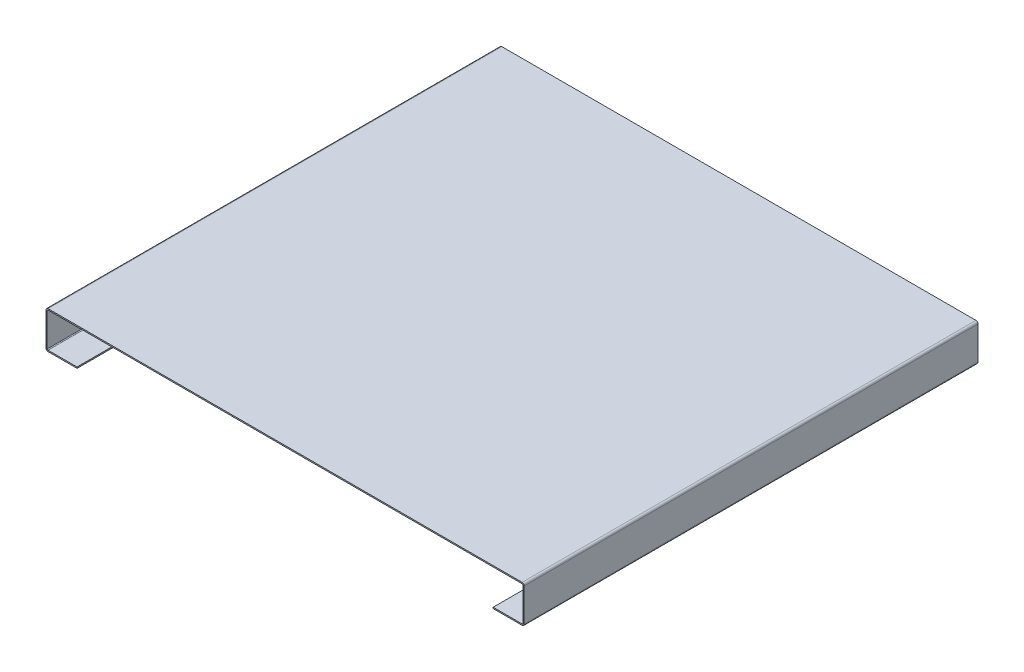
ISO-10303-21;
HEADER;
FILE_DESCRIPTION(('STEP AP214'),'2;1');
FILE_NAME('part.step','',(''),(''),'','','');
FILE_SCHEMA(('AUTOMOTIVE_DESIGN { 1 0 10303 214 1 1 1 1 }'));
ENDSEC;
DATA;
#1=APPLICATION_CONTEXT('core data for automotive mechanical design processes');
#2=APPLICATION_PROTOCOL_DEFINITION('international standard','automotive_design',2000,#1);
#3=PRODUCT_CONTEXT('',#1,'mechanical');
#4=PRODUCT('Part','Part','',(#3));
#5=PRODUCT_RELATED_PRODUCT_CATEGORY('part','',(#4));
#6=PRODUCT_DEFINITION_FORMATION('','',#4);
#7=PRODUCT_DEFINITION_CONTEXT('part definition',#1,'design');
#8=PRODUCT_DEFINITION('design','',#6,#7);
#9=PRODUCT_DEFINITION_SHAPE('','',#8);
#10=(LENGTH_UNIT() NAMED_UNIT(*) SI_UNIT(.MILLI.,.METRE.));
#11=(NAMED_UNIT(*) PLANE_ANGLE_UNIT() SI_UNIT($,.RADIAN.));
#12=(NAMED_UNIT(*) SI_UNIT($,.STERADIAN.) SOLID_ANGLE_UNIT());
#13=UNCERTAINTY_MEASURE_WITH_UNIT(LENGTH_MEASURE(1.E-05),#10,'distance_accuracy_value','');
#14=(GEOMETRIC_REPRESENTATION_CONTEXT(3) GLOBAL_UNCERTAINTY_ASSIGNED_CONTEXT((#13)) GLOBAL_UNIT_ASSIGNED_CONTEXT((#10,
#11,#12)) REPRESENTATION_CONTEXT('',''));
#15=CARTESIAN_POINT('',(0.,0.,0.));
#16=DIRECTION('',(0.,0.,1.));
#17=DIRECTION('',(1.,0.,0.));
#18=AXIS2_PLACEMENT_3D('',#15,#16,#17);
#19=CARTESIAN_POINT('',(0.,5.,1096.));
#20=DIRECTION('',(0.,0.,1.));
#21=DIRECTION('',(1.,0.,0.));
#22=AXIS2_PLACEMENT_3D('',#19,#20,#21);
#23=PLANE('',#22);
#24=DIRECTION('',(1.,0.,0.));
#25=VECTOR('',#24,1.);
#26=CARTESIAN_POINT('',(0.,5.,1096.));
#27=LINE('',#26,#25);
#28=CARTESIAN_POINT('',(0.,5.,1096.));
#29=VERTEX_POINT('',#28);
#30=CARTESIAN_POINT('',(3.,5.,1096.));
#31=VERTEX_POINT('',#30);
#32=EDGE_CURVE('E11',#29,#31,#27,.T.);
#33=ORIENTED_EDGE('',*,*,#32,.F.);
#34=CARTESIAN_POINT('',(5.,5.,1096.));
#35=DIRECTION('',(0.,0.,1.));
#36=DIRECTION('',(1.,0.,0.));
#37=AXIS2_PLACEMENT_3D('',#34,#35,#36);
#38=CIRCLE('',#37,5.);
#39=CARTESIAN_POINT('',(5.,0.,1096.));
#40=VERTEX_POINT('',#39);
#41=EDGE_CURVE('E367',#40,#29,#38,.F.);
#42=ORIENTED_EDGE('',*,*,#41,.F.);
#43=DIRECTION('',(0.,-1.,0.));
#44=VECTOR('',#43,1.);
#45=CARTESIAN_POINT('',(5.,3.,1096.));
#46=LINE('',#45,#44);
#47=CARTESIAN_POINT('',(5.,3.,1096.));
#48=VERTEX_POINT('',#47);
#49=EDGE_CURVE('E46',#48,#40,#46,.T.);
#50=ORIENTED_EDGE('',*,*,#49,.F.);
#51=CARTESIAN_POINT('',(5.,5.,1096.));
#52=DIRECTION('',(0.,0.,1.));
#53=DIRECTION('',(1.,0.,0.));
#54=AXIS2_PLACEMENT_3D('',#51,#52,#53);
#55=CIRCLE('',#54,2.);
#56=EDGE_CURVE('E380',#48,#31,#55,.F.);
#57=ORIENTED_EDGE('',*,*,#56,.T.);
#58=EDGE_LOOP('',(#33,#42,#50,#57));
#59=FACE_BOUND('',#58,.T.);
#60=ADVANCED_FACE('F38',(#59),#23,.T.);
#61=CARTESIAN_POINT('',(5.,3.,1096.));
#62=DIRECTION('',(0.,0.,1.));
#63=DIRECTION('',(1.,0.,0.));
#64=AXIS2_PLACEMENT_3D('',#61,#62,#63);
#65=PLANE('',#64);
#66=DIRECTION('',(0.,1.,0.));
#67=VECTOR('',#66,1.);
#68=CARTESIAN_POINT('',(0.,0.,1096.));
#69=LINE('',#68,#67);
#70=CARTESIAN_POINT('',(0.,84.9999999999999,1096.));
#71=VERTEX_POINT('',#70);
#72=EDGE_CURVE('E371',#29,#71,#69,.T.);
#73=ORIENTED_EDGE('',*,*,#72,.F.);
#74=ORIENTED_EDGE('',*,*,#32,.T.);
#75=DIRECTION('',(0.,1.,0.));
#76=VECTOR('',#75,1.);
#77=CARTESIAN_POINT('',(3.,0.,1096.));
#78=LINE('',#77,#76);
#79=CARTESIAN_POINT('',(3.,85.,1096.));
#80=VERTEX_POINT('',#79);
#81=EDGE_CURVE('E382',#31,#80,#78,.T.);
#82=ORIENTED_EDGE('',*,*,#81,.T.);
#83=DIRECTION('',(-1.,0.,0.));
#84=VECTOR('',#83,1.);
#85=CARTESIAN_POINT('',(3.,85.,1096.));
#86=LINE('',#85,#84);
#87=EDGE_CURVE('E341',#80,#71,#86,.T.);
#88=ORIENTED_EDGE('',*,*,#87,.T.);
#89=EDGE_LOOP('',(#73,#74,#82,#88));
#90=FACE_BOUND('',#89,.T.);
#91=ADVANCED_FACE('F451',(#90),#65,.T.);
#92=CARTESIAN_POINT('',(5.,0.,0.));
#93=DIRECTION('',(0.,0.,-1.));
#94=DIRECTION('',(-1.,0.,0.));
#95=AXIS2_PLACEMENT_3D('',#92,#93,#94);
#96=PLANE('',#95);
#97=DIRECTION('',(0.,1.,0.));
#98=VECTOR('',#97,1.);
#99=CARTESIAN_POINT('',(5.,0.,0.));
#100=LINE('',#99,#98);
#101=CARTESIAN_POINT('',(5.,0.,0.));
#102=VERTEX_POINT('',#101);
#103=CARTESIAN_POINT('',(5.,3.,0.));
#104=VERTEX_POINT('',#103);
#105=EDGE_CURVE('E347',#102,#104,#100,.T.);
#106=ORIENTED_EDGE('',*,*,#105,.F.);
#107=CARTESIAN_POINT('',(5.,5.,0.));
#108=DIRECTION('',(0.,0.,1.));
#109=DIRECTION('',(1.,0.,0.));
#110=AXIS2_PLACEMENT_3D('',#107,#108,#109);
#111=CIRCLE('',#110,5.);
#112=CARTESIAN_POINT('',(0.,5.,0.));
#113=VERTEX_POINT('',#112);
#114=EDGE_CURVE('E251',#102,#113,#111,.F.);
#115=ORIENTED_EDGE('',*,*,#114,.T.);
#116=DIRECTION('',(-1.,0.,0.));
#117=VECTOR('',#116,1.);
#118=CARTESIAN_POINT('',(3.,5.,0.));
#119=LINE('',#118,#117);
#120=CARTESIAN_POINT('',(3.,5.,0.));
#121=VERTEX_POINT('',#120);
#122=EDGE_CURVE('E345',#121,#113,#119,.T.);
#123=ORIENTED_EDGE('',*,*,#122,.F.);
#124=CARTESIAN_POINT('',(5.,5.,0.));
#125=DIRECTION('',(0.,0.,1.));
#126=DIRECTION('',(1.,0.,0.));
#127=AXIS2_PLACEMENT_3D('',#124,#125,#126);
#128=CIRCLE('',#127,2.);
#129=EDGE_CURVE('E263',#104,#121,#128,.F.);
#130=ORIENTED_EDGE('',*,*,#129,.F.);
#131=EDGE_LOOP('',(#106,#115,#123,#130));
#132=FACE_BOUND('',#131,.T.);
#133=ADVANCED_FACE('F493',(#132),#96,.T.);
#134=CARTESIAN_POINT('',(3.,5.,0.));
#135=DIRECTION('',(0.,0.,-1.));
#136=DIRECTION('',(-1.,0.,0.));
#137=AXIS2_PLACEMENT_3D('',#134,#135,#136);
#138=PLANE('',#137);
#139=DIRECTION('',(-1.,0.,0.));
#140=VECTOR('',#139,1.);
#141=CARTESIAN_POINT('',(75.,0.,0.));
#142=LINE('',#141,#140);
#143=CARTESIAN_POINT('',(75.,0.,0.));
#144=VERTEX_POINT('',#143);
#145=EDGE_CURVE('E254',#144,#102,#142,.T.);
#146=ORIENTED_EDGE('',*,*,#145,.T.);
#147=ORIENTED_EDGE('',*,*,#105,.T.);
#148=DIRECTION('',(-1.,0.,0.));
#149=VECTOR('',#148,1.);
#150=CARTESIAN_POINT('',(75.,3.,0.));
#151=LINE('',#150,#149);
#152=CARTESIAN_POINT('',(75.,3.,0.));
#153=VERTEX_POINT('',#152);
#154=EDGE_CURVE('E260',#153,#104,#151,.T.);
#155=ORIENTED_EDGE('',*,*,#154,.F.);
#156=DIRECTION('',(0.,-1.,0.));
#157=VECTOR('',#156,1.);
#158=CARTESIAN_POINT('',(75.,3.,0.));
#159=LINE('',#158,#157);
#160=EDGE_CURVE('E257',#153,#144,#159,.T.);
#161=ORIENTED_EDGE('',*,*,#160,.T.);
#162=EDGE_LOOP('',(#146,#147,#155,#161));
#163=FACE_BOUND('',#162,.T.);
#164=ADVANCED_FACE('F497',(#163),#138,.T.);
#165=CARTESIAN_POINT('',(5.,90.,1096.));
#166=DIRECTION('',(0.,0.,1.));
#167=DIRECTION('',(1.,0.,0.));
#168=AXIS2_PLACEMENT_3D('',#165,#166,#167);
#169=PLANE('',#168);
#170=DIRECTION('',(0.,-1.,0.));
#171=VECTOR('',#170,1.);
#172=CARTESIAN_POINT('',(5.,90.,1096.));
#173=LINE('',#172,#171);
#174=CARTESIAN_POINT('',(5.,90.,1096.));
#175=VERTEX_POINT('',#174);
#176=CARTESIAN_POINT('',(5.,87.,1096.));
#177=VERTEX_POINT('',#176);
#178=EDGE_CURVE('E343',#175,#177,#173,.T.);
#179=ORIENTED_EDGE('',*,*,#178,.F.);
#180=CARTESIAN_POINT('',(5.,85.,1096.));
#181=DIRECTION('',(0.,0.,1.));
#182=DIRECTION('',(1.,0.,0.));
#183=AXIS2_PLACEMENT_3D('',#180,#181,#182);
#184=CIRCLE('',#183,5.);
#185=EDGE_CURVE('E441',#71,#175,#184,.F.);
#186=ORIENTED_EDGE('',*,*,#185,.F.);
#187=ORIENTED_EDGE('',*,*,#87,.F.);
#188=CARTESIAN_POINT('',(5.,85.,1096.));
#189=DIRECTION('',(0.,0.,1.));
#190=DIRECTION('',(1.,0.,0.));
#191=AXIS2_PLACEMENT_3D('',#188,#189,#190);
#192=CIRCLE('',#191,2.);
#193=EDGE_CURVE('E385',#80,#177,#192,.F.);
#194=ORIENTED_EDGE('',*,*,#193,.T.);
#195=EDGE_LOOP('',(#179,#186,#187,#194));
#196=FACE_BOUND('',#195,.T.);
#197=ADVANCED_FACE('F458',(#196),#169,.T.);
#198=CARTESIAN_POINT('',(3.,85.,1096.));
#199=DIRECTION('',(0.,0.,1.));
#200=DIRECTION('',(1.,0.,0.));
#201=AXIS2_PLACEMENT_3D('',#198,#199,#200);
#202=PLANE('',#201);
#203=DIRECTION('',(1.,0.,0.));
#204=VECTOR('',#203,1.);
#205=CARTESIAN_POINT('',(0.,90.,1096.));
#206=LINE('',#205,#204);
#207=CARTESIAN_POINT('',(1150.,90.,1096.));
#208=VERTEX_POINT('',#207);
#209=EDGE_CURVE('E438',#175,#208,#206,.T.);
#210=ORIENTED_EDGE('',*,*,#209,.F.);
#211=ORIENTED_EDGE('',*,*,#178,.T.);
#212=DIRECTION('',(1.,0.,0.));
#213=VECTOR('',#212,1.);
#214=CARTESIAN_POINT('',(0.,87.,1096.));
#215=LINE('',#214,#213);
#216=CARTESIAN_POINT('',(1150.,87.,1096.));
#217=VERTEX_POINT('',#216);
#218=EDGE_CURVE('E205',#177,#217,#215,.T.);
#219=ORIENTED_EDGE('',*,*,#218,.T.);
#220=DIRECTION('',(0.,1.,0.));
#221=VECTOR('',#220,1.);
#222=CARTESIAN_POINT('',(1150.,87.,1096.));
#223=LINE('',#222,#221);
#224=EDGE_CURVE('E196',#217,#208,#223,.T.);
#225=ORIENTED_EDGE('',*,*,#224,.T.);
#226=EDGE_LOOP('',(#210,#211,#219,#225));
#227=FACE_BOUND('',#226,.T.);
#228=ADVANCED_FACE('F391',(#227),#202,.T.);
#229=CARTESIAN_POINT('',(0.,84.9999999999999,0.));
#230=DIRECTION('',(0.,0.,-1.));
#231=DIRECTION('',(-1.,0.,0.));
#232=AXIS2_PLACEMENT_3D('',#229,#230,#231);
#233=PLANE('',#232);
#234=DIRECTION('',(1.,0.,0.));
#235=VECTOR('',#234,1.);
#236=CARTESIAN_POINT('',(0.,84.9999999999999,0.));
#237=LINE('',#236,#235);
#238=CARTESIAN_POINT('',(0.,84.9999999999999,0.));
#239=VERTEX_POINT('',#238);
#240=CARTESIAN_POINT('',(3.,85.,0.));
#241=VERTEX_POINT('',#240);
#242=EDGE_CURVE('E339',#239,#241,#237,.T.);
#243=ORIENTED_EDGE('',*,*,#242,.F.);
#244=CARTESIAN_POINT('',(5.,85.,0.));
#245=DIRECTION('',(0.,0.,1.));
#246=DIRECTION('',(1.,0.,0.));
#247=AXIS2_PLACEMENT_3D('',#244,#245,#246);
#248=CIRCLE('',#247,5.);
#249=CARTESIAN_POINT('',(5.,90.,0.));
#250=VERTEX_POINT('',#249);
#251=EDGE_CURVE('E245',#239,#250,#248,.F.);
#252=ORIENTED_EDGE('',*,*,#251,.T.);
#253=DIRECTION('',(0.,1.,0.));
#254=VECTOR('',#253,1.);
#255=CARTESIAN_POINT('',(5.,87.,0.));
#256=LINE('',#255,#254);
#257=CARTESIAN_POINT('',(5.,87.,0.));
#258=VERTEX_POINT('',#257);
#259=EDGE_CURVE('E195',#258,#250,#256,.T.);
#260=ORIENTED_EDGE('',*,*,#259,.F.);
#261=CARTESIAN_POINT('',(5.,85.,0.));
#262=DIRECTION('',(0.,0.,1.));
#263=DIRECTION('',(1.,0.,0.));
#264=AXIS2_PLACEMENT_3D('',#261,#262,#263);
#265=CIRCLE('',#264,2.);
#266=EDGE_CURVE('E269',#241,#258,#265,.F.);
#267=ORIENTED_EDGE('',*,*,#266,.F.);
#268=EDGE_LOOP('',(#243,#252,#260,#267));
#269=FACE_BOUND('',#268,.T.);
#270=ADVANCED_FACE('F467',(#269),#233,.T.);
#271=CARTESIAN_POINT('',(5.,87.,0.));
#272=DIRECTION('',(0.,0.,-1.));
#273=DIRECTION('',(-1.,0.,0.));
#274=AXIS2_PLACEMENT_3D('',#271,#272,#273);
#275=PLANE('',#274);
#276=DIRECTION('',(0.,1.,0.));
#277=VECTOR('',#276,1.);
#278=CARTESIAN_POINT('',(0.,0.,0.));
#279=LINE('',#278,#277);
#280=EDGE_CURVE('E248',#113,#239,#279,.T.);
#281=ORIENTED_EDGE('',*,*,#280,.T.);
#282=ORIENTED_EDGE('',*,*,#242,.T.);
#283=DIRECTION('',(0.,1.,0.));
#284=VECTOR('',#283,1.);
#285=CARTESIAN_POINT('',(3.,0.,0.));
#286=LINE('',#285,#284);
#287=EDGE_CURVE('E266',#121,#241,#286,.T.);
#288=ORIENTED_EDGE('',*,*,#287,.F.);
#289=ORIENTED_EDGE('',*,*,#122,.T.);
#290=EDGE_LOOP('',(#281,#282,#288,#289));
#291=FACE_BOUND('',#290,.T.);
#292=ADVANCED_FACE('F471',(#291),#275,.T.);
#293=CARTESIAN_POINT('',(1155.,85.,1096.));
#294=DIRECTION('',(0.,0.,1.));
#295=DIRECTION('',(1.,0.,0.));
#296=AXIS2_PLACEMENT_3D('',#293,#294,#295);
#297=PLANE('',#296);
#298=DIRECTION('',(-1.,0.,0.));
#299=VECTOR('',#298,1.);
#300=CARTESIAN_POINT('',(1155.,85.,1096.));
#301=LINE('',#300,#299);
#302=CARTESIAN_POINT('',(1155.,85.,1096.));
#303=VERTEX_POINT('',#302);
#304=CARTESIAN_POINT('',(1152.,85.,1096.));
#305=VERTEX_POINT('',#304);
#306=EDGE_CURVE('E183',#303,#305,#301,.T.);
#307=ORIENTED_EDGE('',*,*,#306,.F.);
#308=CARTESIAN_POINT('',(1150.,85.,1096.));
#309=DIRECTION('',(0.,0.,1.));
#310=DIRECTION('',(1.,0.,0.));
#311=AXIS2_PLACEMENT_3D('',#308,#309,#310);
#312=CIRCLE('',#311,5.);
#313=EDGE_CURVE('E403',#208,#303,#312,.F.);
#314=ORIENTED_EDGE('',*,*,#313,.F.);
#315=ORIENTED_EDGE('',*,*,#224,.F.);
#316=CARTESIAN_POINT('',(1150.,85.,1096.));
#317=DIRECTION('',(0.,0.,1.));
#318=DIRECTION('',(1.,0.,0.));
#319=AXIS2_PLACEMENT_3D('',#316,#317,#318);
#320=CIRCLE('',#319,2.);
#321=EDGE_CURVE('E199',#217,#305,#320,.F.);
#322=ORIENTED_EDGE('',*,*,#321,.T.);
#323=EDGE_LOOP('',(#307,#314,#315,#322));
#324=FACE_BOUND('',#323,.T.);
#325=ADVANCED_FACE('F201',(#324),#297,.T.);
#326=CARTESIAN_POINT('',(1150.,87.,1096.));
#327=DIRECTION('',(0.,0.,1.));
#328=DIRECTION('',(1.,0.,0.));
#329=AXIS2_PLACEMENT_3D('',#326,#327,#328);
#330=PLANE('',#329);
#331=DIRECTION('',(0.,-1.,0.));
#332=VECTOR('',#331,1.);
#333=CARTESIAN_POINT('',(1155.,90.,1096.));
#334=LINE('',#333,#332);
#335=CARTESIAN_POINT('',(1155.,5.00000000000007,1096.));
#336=VERTEX_POINT('',#335);
#337=EDGE_CURVE('E190',#303,#336,#334,.T.);
#338=ORIENTED_EDGE('',*,*,#337,.F.);
#339=ORIENTED_EDGE('',*,*,#306,.T.);
#340=DIRECTION('',(0.,1.,0.));
#341=VECTOR('',#340,1.);
#342=CARTESIAN_POINT('',(1152.,90.,1096.));
#343=LINE('',#342,#341);
#344=CARTESIAN_POINT('',(1152.,5.00000000000004,1096.));
#345=VERTEX_POINT('',#344);
#346=EDGE_CURVE('E187',#305,#345,#343,.F.);
#347=ORIENTED_EDGE('',*,*,#346,.T.);
#348=DIRECTION('',(1.,0.,0.));
#349=VECTOR('',#348,1.);
#350=CARTESIAN_POINT('',(1152.,5.00000000000004,1096.));
#351=LINE('',#350,#349);
#352=EDGE_CURVE('E330',#345,#336,#351,.T.);
#353=ORIENTED_EDGE('',*,*,#352,.T.);
#354=EDGE_LOOP('',(#338,#339,#347,#353));
#355=FACE_BOUND('',#354,.T.);
#356=ADVANCED_FACE('F185',(#355),#330,.T.);
#357=CARTESIAN_POINT('',(1150.,90.,0.));
#358=DIRECTION('',(0.,0.,-1.));
#359=DIRECTION('',(-1.,0.,0.));
#360=AXIS2_PLACEMENT_3D('',#357,#358,#359);
#361=PLANE('',#360);
#362=DIRECTION('',(0.,-1.,0.));
#363=VECTOR('',#362,1.);
#364=CARTESIAN_POINT('',(1150.,90.,0.));
#365=LINE('',#364,#363);
#366=CARTESIAN_POINT('',(1150.,90.,0.));
#367=VERTEX_POINT('',#366);
#368=CARTESIAN_POINT('',(1150.,87.,0.));
#369=VERTEX_POINT('',#368);
#370=EDGE_CURVE('E335',#367,#369,#365,.T.);
#371=ORIENTED_EDGE('',*,*,#370,.F.);
#372=CARTESIAN_POINT('',(1150.,85.,0.));
#373=DIRECTION('',(0.,0.,1.));
#374=DIRECTION('',(1.,0.,0.));
#375=AXIS2_PLACEMENT_3D('',#372,#373,#374);
#376=CIRCLE('',#375,5.);
#377=CARTESIAN_POINT('',(1155.,85.,0.));
#378=VERTEX_POINT('',#377);
#379=EDGE_CURVE('E239',#367,#378,#376,.F.);
#380=ORIENTED_EDGE('',*,*,#379,.T.);
#381=DIRECTION('',(1.,0.,0.));
#382=VECTOR('',#381,1.);
#383=CARTESIAN_POINT('',(1152.,85.,0.));
#384=LINE('',#383,#382);
#385=CARTESIAN_POINT('',(1152.,85.,0.));
#386=VERTEX_POINT('',#385);
#387=EDGE_CURVE('E333',#386,#378,#384,.T.);
#388=ORIENTED_EDGE('',*,*,#387,.F.);
#389=CARTESIAN_POINT('',(1150.,85.,0.));
#390=DIRECTION('',(0.,0.,1.));
#391=DIRECTION('',(1.,0.,0.));
#392=AXIS2_PLACEMENT_3D('',#389,#390,#391);
#393=CIRCLE('',#392,2.);
#394=EDGE_CURVE('E212',#369,#386,#393,.F.);
#395=ORIENTED_EDGE('',*,*,#394,.F.);
#396=EDGE_LOOP('',(#371,#380,#388,#395));
#397=FACE_BOUND('',#396,.T.);
#398=ADVANCED_FACE('F397',(#397),#361,.T.);
#399=CARTESIAN_POINT('',(1152.,85.,0.));
#400=DIRECTION('',(0.,0.,-1.));
#401=DIRECTION('',(-1.,0.,0.));
#402=AXIS2_PLACEMENT_3D('',#399,#400,#401);
#403=PLANE('',#402);
#404=DIRECTION('',(1.,0.,0.));
#405=VECTOR('',#404,1.);
#406=CARTESIAN_POINT('',(0.,90.,0.));
#407=LINE('',#406,#405);
#408=EDGE_CURVE('E242',#250,#367,#407,.T.);
#409=ORIENTED_EDGE('',*,*,#408,.T.);
#410=ORIENTED_EDGE('',*,*,#370,.T.);
#411=DIRECTION('',(1.,0.,0.));
#412=VECTOR('',#411,1.);
#413=CARTESIAN_POINT('',(0.,87.,0.));
#414=LINE('',#413,#412);
#415=EDGE_CURVE('E272',#258,#369,#414,.T.);
#416=ORIENTED_EDGE('',*,*,#415,.F.);
#417=ORIENTED_EDGE('',*,*,#259,.T.);
#418=EDGE_LOOP('',(#409,#410,#416,#417));
#419=FACE_BOUND('',#418,.T.);
#420=ADVANCED_FACE('F477',(#419),#403,.T.);
#421=CARTESIAN_POINT('',(1150.,0.,1096.));
#422=DIRECTION('',(0.,0.,1.));
#423=DIRECTION('',(1.,0.,0.));
#424=AXIS2_PLACEMENT_3D('',#421,#422,#423);
#425=PLANE('',#424);
#426=DIRECTION('',(0.,1.,0.));
#427=VECTOR('',#426,1.);
#428=CARTESIAN_POINT('',(1150.,0.,1096.));
#429=LINE('',#428,#427);
#430=CARTESIAN_POINT('',(1150.,0.,1096.));
#431=VERTEX_POINT('',#430);
#432=CARTESIAN_POINT('',(1150.,3.,1096.));
#433=VERTEX_POINT('',#432);
#434=EDGE_CURVE('E54',#431,#433,#429,.T.);
#435=ORIENTED_EDGE('',*,*,#434,.F.);
#436=CARTESIAN_POINT('',(1150.,5.00000000000002,1096.));
#437=DIRECTION('',(0.,0.,1.));
#438=DIRECTION('',(1.,0.,0.));
#439=AXIS2_PLACEMENT_3D('',#436,#437,#438);
#440=CIRCLE('',#439,5.);
#441=EDGE_CURVE('E431',#336,#431,#440,.F.);
#442=ORIENTED_EDGE('',*,*,#441,.F.);
#443=ORIENTED_EDGE('',*,*,#352,.F.);
#444=CARTESIAN_POINT('',(1150.,5.00000000000002,1096.));
#445=DIRECTION('',(0.,0.,1.));
#446=DIRECTION('',(1.,0.,0.));
#447=AXIS2_PLACEMENT_3D('',#444,#445,#446);
#448=CIRCLE('',#447,2.);
#449=EDGE_CURVE('E220',#345,#433,#448,.F.);
#450=ORIENTED_EDGE('',*,*,#449,.T.);
#451=EDGE_LOOP('',(#435,#442,#443,#450));
#452=FACE_BOUND('',#451,.T.);
#453=ADVANCED_FACE('F479',(#452),#425,.T.);
#454=CARTESIAN_POINT('',(1152.,5.00000000000004,1096.));
#455=DIRECTION('',(0.,0.,1.));
#456=DIRECTION('',(1.,0.,0.));
#457=AXIS2_PLACEMENT_3D('',#454,#455,#456);
#458=PLANE('',#457);
#459=DIRECTION('',(-1.,0.,0.));
#460=VECTOR('',#459,1.);
#461=CARTESIAN_POINT('',(1155.,0.,1096.));
#462=LINE('',#461,#460);
#463=CARTESIAN_POINT('',(1080.,0.,1096.));
#464=VERTEX_POINT('',#463);
#465=EDGE_CURVE('E429',#431,#464,#462,.T.);
#466=ORIENTED_EDGE('',*,*,#465,.F.);
#467=ORIENTED_EDGE('',*,*,#434,.T.);
#468=DIRECTION('',(-1.,0.,0.));
#469=VECTOR('',#468,1.);
#470=CARTESIAN_POINT('',(1155.,3.,1096.));
#471=LINE('',#470,#469);
#472=CARTESIAN_POINT('',(1080.,2.99999999999999,1096.));
#473=VERTEX_POINT('',#472);
#474=EDGE_CURVE('E132',#433,#473,#471,.T.);
#475=ORIENTED_EDGE('',*,*,#474,.T.);
#476=DIRECTION('',(0.,1.,0.));
#477=VECTOR('',#476,1.);
#478=CARTESIAN_POINT('',(1080.,0.,1096.));
#479=LINE('',#478,#477);
#480=EDGE_CURVE('E427',#464,#473,#479,.T.);
#481=ORIENTED_EDGE('',*,*,#480,.F.);
#482=EDGE_LOOP('',(#466,#467,#475,#481));
#483=FACE_BOUND('',#482,.T.);
#484=ADVANCED_FACE('F485',(#483),#458,.T.);
#485=CARTESIAN_POINT('',(1155.,5.00000000000007,0.));
#486=DIRECTION('',(0.,0.,-1.));
#487=DIRECTION('',(-1.,0.,0.));
#488=AXIS2_PLACEMENT_3D('',#485,#486,#487);
#489=PLANE('',#488);
#490=DIRECTION('',(-1.,0.,0.));
#491=VECTOR('',#490,1.);
#492=CARTESIAN_POINT('',(1155.,5.00000000000007,0.));
#493=LINE('',#492,#491);
#494=CARTESIAN_POINT('',(1155.,5.00000000000007,0.));
#495=VERTEX_POINT('',#494);
#496=CARTESIAN_POINT('',(1152.,5.00000000000004,0.));
#497=VERTEX_POINT('',#496);
#498=EDGE_CURVE('E119',#495,#497,#493,.T.);
#499=ORIENTED_EDGE('',*,*,#498,.F.);
#500=CARTESIAN_POINT('',(1150.,5.00000000000002,0.));
#501=DIRECTION('',(0.,0.,1.));
#502=DIRECTION('',(1.,0.,0.));
#503=AXIS2_PLACEMENT_3D('',#500,#501,#502);
#504=CIRCLE('',#503,5.);
#505=CARTESIAN_POINT('',(1150.,0.,0.));
#506=VERTEX_POINT('',#505);
#507=EDGE_CURVE('E235',#495,#506,#504,.F.);
#508=ORIENTED_EDGE('',*,*,#507,.T.);
#509=DIRECTION('',(0.,-1.,0.));
#510=VECTOR('',#509,1.);
#511=CARTESIAN_POINT('',(1150.,3.,0.));
#512=LINE('',#511,#510);
#513=CARTESIAN_POINT('',(1150.,3.,0.));
#514=VERTEX_POINT('',#513);
#515=EDGE_CURVE('E126',#514,#506,#512,.T.);
#516=ORIENTED_EDGE('',*,*,#515,.F.);
#517=CARTESIAN_POINT('',(1150.,5.00000000000002,0.));
#518=DIRECTION('',(0.,0.,1.));
#519=DIRECTION('',(1.,0.,0.));
#520=AXIS2_PLACEMENT_3D('',#517,#518,#519);
#521=CIRCLE('',#520,2.);
#522=EDGE_CURVE('E278',#497,#514,#521,.F.);
#523=ORIENTED_EDGE('',*,*,#522,.F.);
#524=EDGE_LOOP('',(#499,#508,#516,#523));
#525=FACE_BOUND('',#524,.T.);
#526=ADVANCED_FACE('F414',(#525),#489,.T.);
#527=CARTESIAN_POINT('',(1150.,3.,0.));
#528=DIRECTION('',(0.,0.,-1.));
#529=DIRECTION('',(-1.,0.,0.));
#530=AXIS2_PLACEMENT_3D('',#527,#528,#529);
#531=PLANE('',#530);
#532=DIRECTION('',(0.,-1.,0.));
#533=VECTOR('',#532,1.);
#534=CARTESIAN_POINT('',(1155.,90.,0.));
#535=LINE('',#534,#533);
#536=EDGE_CURVE('E237',#378,#495,#535,.T.);
#537=ORIENTED_EDGE('',*,*,#536,.T.);
#538=ORIENTED_EDGE('',*,*,#498,.T.);
#539=DIRECTION('',(0.,1.,0.));
#540=VECTOR('',#539,1.);
#541=CARTESIAN_POINT('',(1152.,90.,0.));
#542=LINE('',#541,#540);
#543=EDGE_CURVE('E276',#386,#497,#542,.F.);
#544=ORIENTED_EDGE('',*,*,#543,.F.);
#545=ORIENTED_EDGE('',*,*,#387,.T.);
#546=EDGE_LOOP('',(#537,#538,#544,#545));
#547=FACE_BOUND('',#546,.T.);
#548=ADVANCED_FACE('F399',(#547),#531,.T.);
#549=CARTESIAN_POINT('',(1155.,3.,1096.));
#550=DIRECTION('',(0.,-1.,0.));
#551=DIRECTION('',(1.,0.,0.));
#552=AXIS2_PLACEMENT_3D('',#549,#550,#551);
#553=PLANE('',#552);
#554=DIRECTION('',(-1.,0.,0.));
#555=VECTOR('',#554,1.);
#556=CARTESIAN_POINT('',(1155.,3.,0.));
#557=LINE('',#556,#555);
#558=CARTESIAN_POINT('',(1080.,2.99999999999999,0.));
#559=VERTEX_POINT('',#558);
#560=EDGE_CURVE('E226',#514,#559,#557,.T.);
#561=ORIENTED_EDGE('',*,*,#560,.T.);
#562=DIRECTION('',(0.,0.,-1.));
#563=VECTOR('',#562,1.);
#564=CARTESIAN_POINT('',(1080.,2.99999999999999,1096.));
#565=LINE('',#564,#563);
#566=EDGE_CURVE('E326',#473,#559,#565,.T.);
#567=ORIENTED_EDGE('',*,*,#566,.F.);
#568=ORIENTED_EDGE('',*,*,#474,.F.);
#569=DIRECTION('',(0.,0.,-1.));
#570=VECTOR('',#569,1.);
#571=CARTESIAN_POINT('',(1150.,3.,1096.));
#572=LINE('',#571,#570);
#573=EDGE_CURVE('E222',#433,#514,#572,.T.);
#574=ORIENTED_EDGE('',*,*,#573,.T.);
#575=EDGE_LOOP('',(#561,#567,#568,#574));
#576=FACE_BOUND('',#575,.T.);
#577=ADVANCED_FACE('F420',(#576),#553,.F.);
#578=CARTESIAN_POINT('',(1080.,0.,1096.));
#579=DIRECTION('',(-1.,0.,0.));
#580=DIRECTION('',(0.,0.,1.));
#581=AXIS2_PLACEMENT_3D('',#578,#579,#580);
#582=PLANE('',#581);
#583=DIRECTION('',(0.,1.,0.));
#584=VECTOR('',#583,1.);
#585=CARTESIAN_POINT('',(1080.,0.,0.));
#586=LINE('',#585,#584);
#587=CARTESIAN_POINT('',(1080.,0.,0.));
#588=VERTEX_POINT('',#587);
#589=EDGE_CURVE('E229',#588,#559,#586,.T.);
#590=ORIENTED_EDGE('',*,*,#589,.F.);
#591=DIRECTION('',(0.,0.,-1.));
#592=VECTOR('',#591,1.);
#593=CARTESIAN_POINT('',(1080.,0.,1096.));
#594=LINE('',#593,#592);
#595=EDGE_CURVE('E324',#464,#588,#594,.T.);
#596=ORIENTED_EDGE('',*,*,#595,.F.);
#597=ORIENTED_EDGE('',*,*,#480,.T.);
#598=ORIENTED_EDGE('',*,*,#566,.T.);
#599=EDGE_LOOP('',(#590,#596,#597,#598));
#600=FACE_BOUND('',#599,.T.);
#601=ADVANCED_FACE('F425',(#600),#582,.T.);
#602=CARTESIAN_POINT('',(1155.,0.,1096.));
#603=DIRECTION('',(0.,-1.,0.));
#604=DIRECTION('',(1.,0.,0.));
#605=AXIS2_PLACEMENT_3D('',#602,#603,#604);
#606=PLANE('',#605);
#607=DIRECTION('',(-1.,0.,0.));
#608=VECTOR('',#607,1.);
#609=CARTESIAN_POINT('',(1155.,0.,0.));
#610=LINE('',#609,#608);
#611=EDGE_CURVE('E232',#506,#588,#610,.T.);
#612=ORIENTED_EDGE('',*,*,#611,.F.);
#613=DIRECTION('',(0.,0.,-1.));
#614=VECTOR('',#613,1.);
#615=CARTESIAN_POINT('',(1150.,0.,1096.));
#616=LINE('',#615,#614);
#617=EDGE_CURVE('E321',#431,#506,#616,.T.);
#618=ORIENTED_EDGE('',*,*,#617,.F.);
#619=ORIENTED_EDGE('',*,*,#465,.T.);
#620=ORIENTED_EDGE('',*,*,#595,.T.);
#621=EDGE_LOOP('',(#612,#618,#619,#620));
#622=FACE_BOUND('',#621,.T.);
#623=ADVANCED_FACE('F581',(#622),#606,.T.);
#624=CARTESIAN_POINT('',(1150.,5.00000000000002,1096.));
#625=DIRECTION('',(0.,0.,-1.));
#626=DIRECTION('',(-1.,0.,0.));
#627=AXIS2_PLACEMENT_3D('',#624,#625,#626);
#628=CYLINDRICAL_SURFACE('',#627,5.);
#629=ORIENTED_EDGE('',*,*,#507,.F.);
#630=DIRECTION('',(0.,0.,-1.));
#631=VECTOR('',#630,1.);
#632=CARTESIAN_POINT('',(1155.,5.00000000000007,1096.));
#633=LINE('',#632,#631);
#634=EDGE_CURVE('E318',#336,#495,#633,.T.);
#635=ORIENTED_EDGE('',*,*,#634,.F.);
#636=ORIENTED_EDGE('',*,*,#441,.T.);
#637=ORIENTED_EDGE('',*,*,#617,.T.);
#638=EDGE_LOOP('',(#629,#635,#636,#637));
#639=FACE_BOUND('',#638,.T.);
#640=ADVANCED_FACE('F411',(#639),#628,.T.);
#641=CARTESIAN_POINT('',(1155.,90.,1096.));
#642=DIRECTION('',(1.,0.,0.));
#643=DIRECTION('',(0.,0.,-1.));
#644=AXIS2_PLACEMENT_3D('',#641,#642,#643);
#645=PLANE('',#644);
#646=ORIENTED_EDGE('',*,*,#536,.F.);
#647=DIRECTION('',(0.,0.,-1.));
#648=VECTOR('',#647,1.);
#649=CARTESIAN_POINT('',(1155.,85.,1096.));
#650=LINE('',#649,#648);
#651=EDGE_CURVE('E315',#303,#378,#650,.T.);
#652=ORIENTED_EDGE('',*,*,#651,.F.);
#653=ORIENTED_EDGE('',*,*,#337,.T.);
#654=ORIENTED_EDGE('',*,*,#634,.T.);
#655=EDGE_LOOP('',(#646,#652,#653,#654));
#656=FACE_BOUND('',#655,.T.);
#657=ADVANCED_FACE('F405',(#656),#645,.T.);
#658=CARTESIAN_POINT('',(1150.,85.,1096.));
#659=DIRECTION('',(0.,0.,-1.));
#660=DIRECTION('',(-1.,0.,0.));
#661=AXIS2_PLACEMENT_3D('',#658,#659,#660);
#662=CYLINDRICAL_SURFACE('',#661,5.);
#663=ORIENTED_EDGE('',*,*,#379,.F.);
#664=DIRECTION('',(0.,0.,-1.));
#665=VECTOR('',#664,1.);
#666=CARTESIAN_POINT('',(1150.,90.,1096.));
#667=LINE('',#666,#665);
#668=EDGE_CURVE('E312',#208,#367,#667,.T.);
#669=ORIENTED_EDGE('',*,*,#668,.F.);
#670=ORIENTED_EDGE('',*,*,#313,.T.);
#671=ORIENTED_EDGE('',*,*,#651,.T.);
#672=EDGE_LOOP('',(#663,#669,#670,#671));
#673=FACE_BOUND('',#672,.T.);
#674=ADVANCED_FACE('F402',(#673),#662,.T.);
#675=CARTESIAN_POINT('',(0.,90.,1096.));
#676=DIRECTION('',(0.,1.,0.));
#677=DIRECTION('',(0.,0.,1.));
#678=AXIS2_PLACEMENT_3D('',#675,#676,#677);
#679=PLANE('',#678);
#680=ORIENTED_EDGE('',*,*,#408,.F.);
#681=DIRECTION('',(0.,0.,-1.));
#682=VECTOR('',#681,1.);
#683=CARTESIAN_POINT('',(5.,90.,1096.));
#684=LINE('',#683,#682);
#685=EDGE_CURVE('E309',#175,#250,#684,.T.);
#686=ORIENTED_EDGE('',*,*,#685,.F.);
#687=ORIENTED_EDGE('',*,*,#209,.T.);
#688=ORIENTED_EDGE('',*,*,#668,.T.);
#689=EDGE_LOOP('',(#680,#686,#687,#688));
#690=FACE_BOUND('',#689,.T.);
#691=ADVANCED_FACE('F464',(#690),#679,.T.);
#692=CARTESIAN_POINT('',(5.,85.,1096.));
#693=DIRECTION('',(0.,0.,-1.));
#694=DIRECTION('',(-1.,0.,0.));
#695=AXIS2_PLACEMENT_3D('',#692,#693,#694);
#696=CYLINDRICAL_SURFACE('',#695,5.);
#697=ORIENTED_EDGE('',*,*,#251,.F.);
#698=DIRECTION('',(0.,0.,-1.));
#699=VECTOR('',#698,1.);
#700=CARTESIAN_POINT('',(0.,84.9999999999999,1096.));
#701=LINE('',#700,#699);
#702=EDGE_CURVE('E306',#71,#239,#701,.T.);
#703=ORIENTED_EDGE('',*,*,#702,.F.);
#704=ORIENTED_EDGE('',*,*,#185,.T.);
#705=ORIENTED_EDGE('',*,*,#685,.T.);
#706=EDGE_LOOP('',(#697,#703,#704,#705));
#707=FACE_BOUND('',#706,.T.);
#708=ADVANCED_FACE('F457',(#707),#696,.T.);
#709=CARTESIAN_POINT('',(0.,0.,1096.));
#710=DIRECTION('',(-1.,0.,0.));
#711=DIRECTION('',(0.,0.,1.));
#712=AXIS2_PLACEMENT_3D('',#709,#710,#711);
#713=PLANE('',#712);
#714=ORIENTED_EDGE('',*,*,#280,.F.);
#715=DIRECTION('',(0.,0.,-1.));
#716=VECTOR('',#715,1.);
#717=CARTESIAN_POINT('',(0.,5.,1096.));
#718=LINE('',#717,#716);
#719=EDGE_CURVE('E303',#29,#113,#718,.T.);
#720=ORIENTED_EDGE('',*,*,#719,.F.);
#721=ORIENTED_EDGE('',*,*,#72,.T.);
#722=ORIENTED_EDGE('',*,*,#702,.T.);
#723=EDGE_LOOP('',(#714,#720,#721,#722));
#724=FACE_BOUND('',#723,.T.);
#725=ADVANCED_FACE('F447',(#724),#713,.T.);
#726=CARTESIAN_POINT('',(5.,5.,1096.));
#727=DIRECTION('',(0.,0.,-1.));
#728=DIRECTION('',(-1.,0.,0.));
#729=AXIS2_PLACEMENT_3D('',#726,#727,#728);
#730=CYLINDRICAL_SURFACE('',#729,5.);
#731=ORIENTED_EDGE('',*,*,#114,.F.);
#732=DIRECTION('',(0.,0.,-1.));
#733=VECTOR('',#732,1.);
#734=CARTESIAN_POINT('',(5.,0.,1096.));
#735=LINE('',#734,#733);
#736=EDGE_CURVE('E300',#40,#102,#735,.T.);
#737=ORIENTED_EDGE('',*,*,#736,.F.);
#738=ORIENTED_EDGE('',*,*,#41,.T.);
#739=ORIENTED_EDGE('',*,*,#719,.T.);
#740=EDGE_LOOP('',(#731,#737,#738,#739));
#741=FACE_BOUND('',#740,.T.);
#742=ADVANCED_FACE('F366',(#741),#730,.T.);
#743=CARTESIAN_POINT('',(75.,0.,1096.));
#744=DIRECTION('',(0.,-1.,0.));
#745=DIRECTION('',(1.,0.,0.));
#746=AXIS2_PLACEMENT_3D('',#743,#744,#745);
#747=PLANE('',#746);
#748=ORIENTED_EDGE('',*,*,#145,.F.);
#749=DIRECTION('',(0.,0.,-1.));
#750=VECTOR('',#749,1.);
#751=CARTESIAN_POINT('',(75.,0.,1096.));
#752=LINE('',#751,#750);
#753=CARTESIAN_POINT('',(75.,0.,1096.));
#754=VERTEX_POINT('',#753);
#755=EDGE_CURVE('E298',#754,#144,#752,.T.);
#756=ORIENTED_EDGE('',*,*,#755,.F.);
#757=DIRECTION('',(-1.,0.,0.));
#758=VECTOR('',#757,1.);
#759=CARTESIAN_POINT('',(75.,0.,1096.));
#760=LINE('',#759,#758);
#761=EDGE_CURVE('E355',#754,#40,#760,.T.);
#762=ORIENTED_EDGE('',*,*,#761,.T.);
#763=ORIENTED_EDGE('',*,*,#736,.T.);
#764=EDGE_LOOP('',(#748,#756,#762,#763));
#765=FACE_BOUND('',#764,.T.);
#766=ADVANCED_FACE('F373',(#765),#747,.T.);
#767=CARTESIAN_POINT('',(75.,3.,1096.));
#768=DIRECTION('',(1.,0.,0.));
#769=DIRECTION('',(0.,0.,-1.));
#770=AXIS2_PLACEMENT_3D('',#767,#768,#769);
#771=PLANE('',#770);
#772=ORIENTED_EDGE('',*,*,#160,.F.);
#773=DIRECTION('',(0.,0.,-1.));
#774=VECTOR('',#773,1.);
#775=CARTESIAN_POINT('',(75.,3.,1096.));
#776=LINE('',#775,#774);
#777=CARTESIAN_POINT('',(75.,3.,1096.));
#778=VERTEX_POINT('',#777);
#779=EDGE_CURVE('E296',#778,#153,#776,.T.);
#780=ORIENTED_EDGE('',*,*,#779,.F.);
#781=DIRECTION('',(0.,-1.,0.));
#782=VECTOR('',#781,1.);
#783=CARTESIAN_POINT('',(75.,3.,1096.));
#784=LINE('',#783,#782);
#785=EDGE_CURVE('E374',#778,#754,#784,.T.);
#786=ORIENTED_EDGE('',*,*,#785,.T.);
#787=ORIENTED_EDGE('',*,*,#755,.T.);
#788=EDGE_LOOP('',(#772,#780,#786,#787));
#789=FACE_BOUND('',#788,.T.);
#790=ADVANCED_FACE('F664',(#789),#771,.T.);
#791=CARTESIAN_POINT('',(75.,3.,1096.));
#792=DIRECTION('',(0.,-1.,0.));
#793=DIRECTION('',(1.,0.,0.));
#794=AXIS2_PLACEMENT_3D('',#791,#792,#793);
#795=PLANE('',#794);
#796=ORIENTED_EDGE('',*,*,#154,.T.);
#797=DIRECTION('',(0.,0.,-1.));
#798=VECTOR('',#797,1.);
#799=CARTESIAN_POINT('',(5.,3.,1096.));
#800=LINE('',#799,#798);
#801=EDGE_CURVE('E293',#48,#104,#800,.T.);
#802=ORIENTED_EDGE('',*,*,#801,.F.);
#803=DIRECTION('',(-1.,0.,0.));
#804=VECTOR('',#803,1.);
#805=CARTESIAN_POINT('',(75.,3.,1096.));
#806=LINE('',#805,#804);
#807=EDGE_CURVE('E358',#778,#48,#806,.T.);
#808=ORIENTED_EDGE('',*,*,#807,.F.);
#809=ORIENTED_EDGE('',*,*,#779,.T.);
#810=EDGE_LOOP('',(#796,#802,#808,#809));
#811=FACE_BOUND('',#810,.T.);
#812=ADVANCED_FACE('F674',(#811),#795,.F.);
#813=CARTESIAN_POINT('',(5.,5.,1096.));
#814=DIRECTION('',(0.,0.,-1.));
#815=DIRECTION('',(-1.,0.,0.));
#816=AXIS2_PLACEMENT_3D('',#813,#814,#815);
#817=CYLINDRICAL_SURFACE('',#816,2.);
#818=ORIENTED_EDGE('',*,*,#129,.T.);
#819=DIRECTION('',(0.,0.,-1.));
#820=VECTOR('',#819,1.);
#821=CARTESIAN_POINT('',(3.,5.,1096.));
#822=LINE('',#821,#820);
#823=EDGE_CURVE('E290',#31,#121,#822,.T.);
#824=ORIENTED_EDGE('',*,*,#823,.F.);
#825=ORIENTED_EDGE('',*,*,#56,.F.);
#826=ORIENTED_EDGE('',*,*,#801,.T.);
#827=EDGE_LOOP('',(#818,#824,#825,#826));
#828=FACE_BOUND('',#827,.T.);
#829=ADVANCED_FACE('F685',(#828),#817,.F.);
#830=CARTESIAN_POINT('',(3.,0.,1096.));
#831=DIRECTION('',(-1.,0.,0.));
#832=DIRECTION('',(0.,0.,1.));
#833=AXIS2_PLACEMENT_3D('',#830,#831,#832);
#834=PLANE('',#833);
#835=ORIENTED_EDGE('',*,*,#287,.T.);
#836=DIRECTION('',(0.,0.,-1.));
#837=VECTOR('',#836,1.);
#838=CARTESIAN_POINT('',(3.,85.,1096.));
#839=LINE('',#838,#837);
#840=EDGE_CURVE('E287',#80,#241,#839,.T.);
#841=ORIENTED_EDGE('',*,*,#840,.F.);
#842=ORIENTED_EDGE('',*,*,#81,.F.);
#843=ORIENTED_EDGE('',*,*,#823,.T.);
#844=EDGE_LOOP('',(#835,#841,#842,#843));
#845=FACE_BOUND('',#844,.T.);
#846=ADVANCED_FACE('F473',(#845),#834,.F.);
#847=CARTESIAN_POINT('',(5.,85.,1096.));
#848=DIRECTION('',(0.,0.,-1.));
#849=DIRECTION('',(-1.,0.,0.));
#850=AXIS2_PLACEMENT_3D('',#847,#848,#849);
#851=CYLINDRICAL_SURFACE('',#850,2.);
#852=ORIENTED_EDGE('',*,*,#266,.T.);
#853=DIRECTION('',(0.,0.,-1.));
#854=VECTOR('',#853,1.);
#855=CARTESIAN_POINT('',(5.,87.,1096.));
#856=LINE('',#855,#854);
#857=EDGE_CURVE('E284',#177,#258,#856,.T.);
#858=ORIENTED_EDGE('',*,*,#857,.F.);
#859=ORIENTED_EDGE('',*,*,#193,.F.);
#860=ORIENTED_EDGE('',*,*,#840,.T.);
#861=EDGE_LOOP('',(#852,#858,#859,#860));
#862=FACE_BOUND('',#861,.T.);
#863=ADVANCED_FACE('F476',(#862),#851,.F.);
#864=CARTESIAN_POINT('',(0.,87.,1096.));
#865=DIRECTION('',(0.,1.,0.));
#866=DIRECTION('',(0.,0.,1.));
#867=AXIS2_PLACEMENT_3D('',#864,#865,#866);
#868=PLANE('',#867);
#869=ORIENTED_EDGE('',*,*,#415,.T.);
#870=DIRECTION('',(0.,0.,-1.));
#871=VECTOR('',#870,1.);
#872=CARTESIAN_POINT('',(1150.,87.,1096.));
#873=LINE('',#872,#871);
#874=EDGE_CURVE('E214',#217,#369,#873,.T.);
#875=ORIENTED_EDGE('',*,*,#874,.F.);
#876=ORIENTED_EDGE('',*,*,#218,.F.);
#877=ORIENTED_EDGE('',*,*,#857,.T.);
#878=EDGE_LOOP('',(#869,#875,#876,#877));
#879=FACE_BOUND('',#878,.T.);
#880=ADVANCED_FACE('F394',(#879),#868,.F.);
#881=CARTESIAN_POINT('',(1150.,85.,1096.));
#882=DIRECTION('',(0.,0.,-1.));
#883=DIRECTION('',(-1.,0.,0.));
#884=AXIS2_PLACEMENT_3D('',#881,#882,#883);
#885=CYLINDRICAL_SURFACE('',#884,2.);
#886=ORIENTED_EDGE('',*,*,#394,.T.);
#887=DIRECTION('',(0.,0.,-1.));
#888=VECTOR('',#887,1.);
#889=CARTESIAN_POINT('',(1152.,85.,1096.));
#890=LINE('',#889,#888);
#891=EDGE_CURVE('E209',#305,#386,#890,.T.);
#892=ORIENTED_EDGE('',*,*,#891,.F.);
#893=ORIENTED_EDGE('',*,*,#321,.F.);
#894=ORIENTED_EDGE('',*,*,#874,.T.);
#895=EDGE_LOOP('',(#886,#892,#893,#894));
#896=FACE_BOUND('',#895,.T.);
#897=ADVANCED_FACE('F210',(#896),#885,.F.);
#898=CARTESIAN_POINT('',(1152.,90.,1096.));
#899=DIRECTION('',(1.,0.,0.));
#900=DIRECTION('',(0.,0.,-1.));
#901=AXIS2_PLACEMENT_3D('',#898,#899,#900);
#902=PLANE('',#901);
#903=ORIENTED_EDGE('',*,*,#543,.T.);
#904=DIRECTION('',(0.,0.,-1.));
#905=VECTOR('',#904,1.);
#906=CARTESIAN_POINT('',(1152.,5.00000000000004,1096.));
#907=LINE('',#906,#905);
#908=EDGE_CURVE('E215',#345,#497,#907,.T.);
#909=ORIENTED_EDGE('',*,*,#908,.F.);
#910=ORIENTED_EDGE('',*,*,#346,.F.);
#911=ORIENTED_EDGE('',*,*,#891,.T.);
#912=EDGE_LOOP('',(#903,#909,#910,#911));
#913=FACE_BOUND('',#912,.T.);
#914=ADVANCED_FACE('F217',(#913),#902,.F.);
#915=CARTESIAN_POINT('',(1150.,5.00000000000002,1096.));
#916=DIRECTION('',(0.,0.,-1.));
#917=DIRECTION('',(-1.,0.,0.));
#918=AXIS2_PLACEMENT_3D('',#915,#916,#917);
#919=CYLINDRICAL_SURFACE('',#918,2.);
#920=ORIENTED_EDGE('',*,*,#522,.T.);
#921=ORIENTED_EDGE('',*,*,#573,.F.);
#922=ORIENTED_EDGE('',*,*,#449,.F.);
#923=ORIENTED_EDGE('',*,*,#908,.T.);
#924=EDGE_LOOP('',(#920,#921,#922,#923));
#925=FACE_BOUND('',#924,.T.);
#926=ADVANCED_FACE('F417',(#925),#919,.F.);
#927=CARTESIAN_POINT('',(1150.,5.00000000000002,1096.));
#928=DIRECTION('',(0.,0.,1.));
#929=DIRECTION('',(1.,0.,0.));
#930=AXIS2_PLACEMENT_3D('',#927,#928,#929);
#931=PLANE('',#930);
#932=ORIENTED_EDGE('',*,*,#807,.T.);
#933=ORIENTED_EDGE('',*,*,#49,.T.);
#934=ORIENTED_EDGE('',*,*,#761,.F.);
#935=ORIENTED_EDGE('',*,*,#785,.F.);
#936=EDGE_LOOP('',(#932,#933,#934,#935));
#937=FACE_BOUND('',#936,.T.);
#938=ADVANCED_FACE('F352',(#937),#931,.T.);
#939=CARTESIAN_POINT('',(1150.,5.00000000000002,0.));
#940=DIRECTION('',(0.,0.,1.));
#941=DIRECTION('',(1.,0.,0.));
#942=AXIS2_PLACEMENT_3D('',#939,#940,#941);
#943=PLANE('',#942);
#944=ORIENTED_EDGE('',*,*,#560,.F.);
#945=ORIENTED_EDGE('',*,*,#515,.T.);
#946=ORIENTED_EDGE('',*,*,#611,.T.);
#947=ORIENTED_EDGE('',*,*,#589,.T.);
#948=EDGE_LOOP('',(#944,#945,#946,#947));
#949=FACE_BOUND('',#948,.T.);
#950=ADVANCED_FACE('F422',(#949),#943,.F.);
#951=CLOSED_SHELL('',(#60,#91,#133,#164,#197,#228,#270,#292,#325,#356,#398,#420,#453,#484,#526,
#548,#577,#601,#623,#640,#657,#674,#691,#708,#725,#742,#766,#790,#812,#829,#846,#863,#880,#897,
#914,#926,#938,#950));
#952=MANIFOLD_SOLID_BREP('B2',#951);
#953=ADVANCED_BREP_SHAPE_REPRESENTATION('',(#18,#952),#14);
#954=SHAPE_DEFINITION_REPRESENTATION(#9,#953);
ENDSEC;
END-ISO-10303-21;
